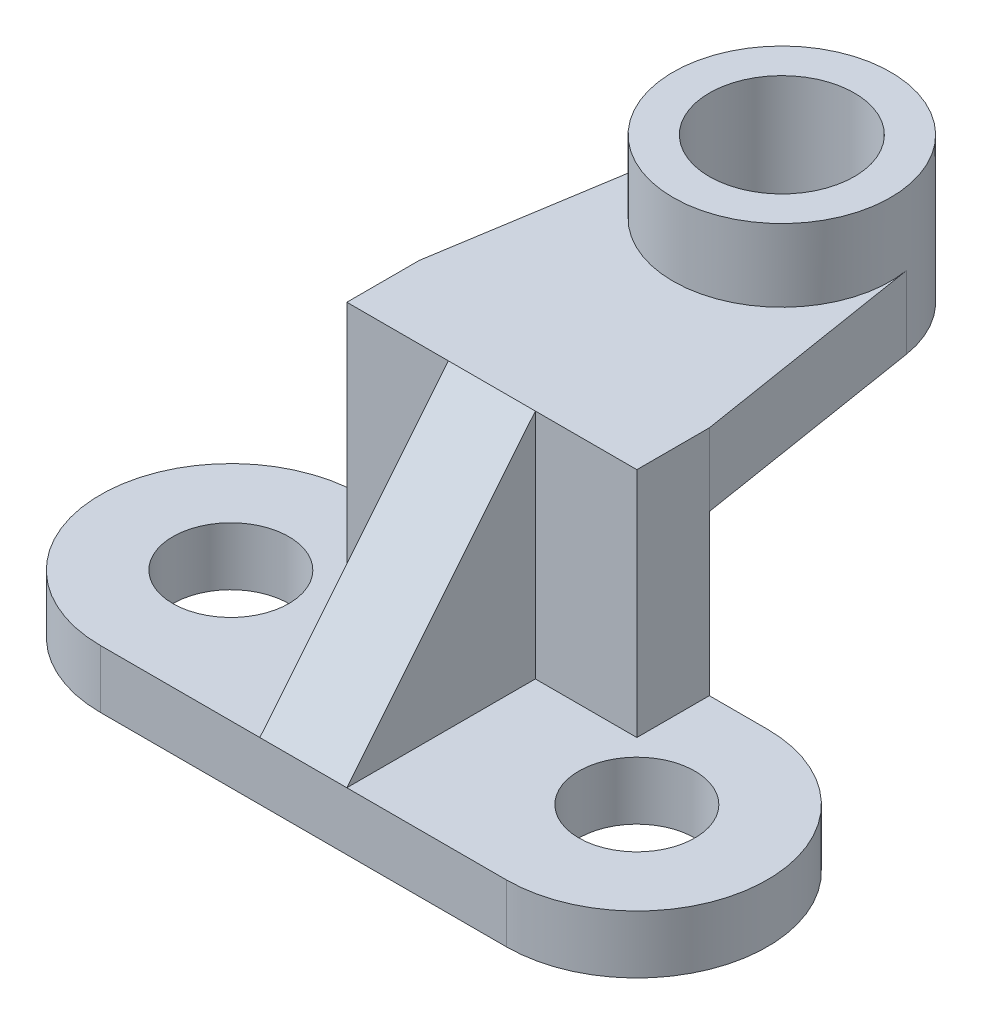
ISO-10303-21;
HEADER;
FILE_DESCRIPTION(('STEP AP214'),'2;1');
FILE_NAME('part.step','',(''),(''),'','','');
FILE_SCHEMA(('AUTOMOTIVE_DESIGN { 1 0 10303 214 1 1 1 1 }'));
ENDSEC;
DATA;
#1=APPLICATION_CONTEXT('core data for automotive mechanical design processes');
#2=APPLICATION_PROTOCOL_DEFINITION('international standard','automotive_design',2000,#1);
#3=PRODUCT_CONTEXT('',#1,'mechanical');
#4=PRODUCT('Part','Part','',(#3));
#5=PRODUCT_RELATED_PRODUCT_CATEGORY('part','',(#4));
#6=PRODUCT_DEFINITION_FORMATION('','',#4);
#7=PRODUCT_DEFINITION_CONTEXT('part definition',#1,'design');
#8=PRODUCT_DEFINITION('design','',#6,#7);
#9=PRODUCT_DEFINITION_SHAPE('','',#8);
#10=(LENGTH_UNIT() NAMED_UNIT(*) SI_UNIT(.MILLI.,.METRE.));
#11=(NAMED_UNIT(*) PLANE_ANGLE_UNIT() SI_UNIT($,.RADIAN.));
#12=(NAMED_UNIT(*) SI_UNIT($,.STERADIAN.) SOLID_ANGLE_UNIT());
#13=UNCERTAINTY_MEASURE_WITH_UNIT(LENGTH_MEASURE(1.E-05),#10,'distance_accuracy_value','');
#14=(GEOMETRIC_REPRESENTATION_CONTEXT(3) GLOBAL_UNCERTAINTY_ASSIGNED_CONTEXT((#13)) GLOBAL_UNIT_ASSIGNED_CONTEXT((#10,
#11,#12)) REPRESENTATION_CONTEXT('',''));
#15=CARTESIAN_POINT('',(0.,0.,0.));
#16=DIRECTION('',(0.,0.,1.));
#17=DIRECTION('',(1.,0.,0.));
#18=AXIS2_PLACEMENT_3D('',#15,#16,#17);
#19=CARTESIAN_POINT('',(-28.,8.,-18.));
#20=DIRECTION('',(0.,0.,1.));
#21=DIRECTION('',(1.,0.,0.));
#22=AXIS2_PLACEMENT_3D('',#19,#20,#21);
#23=PLANE('',#22);
#24=DIRECTION('',(-1.,0.,0.));
#25=VECTOR('',#24,1.);
#26=CARTESIAN_POINT('',(0.,30.,-18.));
#27=LINE('',#26,#25);
#28=CARTESIAN_POINT('',(20.,30.,-18.));
#29=VERTEX_POINT('',#28);
#30=CARTESIAN_POINT('',(-20.,30.,-18.));
#31=VERTEX_POINT('',#30);
#32=EDGE_CURVE('E161',#29,#31,#27,.T.);
#33=ORIENTED_EDGE('',*,*,#32,.F.);
#34=DIRECTION('',(0.,-1.,0.));
#35=VECTOR('',#34,1.);
#36=CARTESIAN_POINT('',(20.,40.,-18.));
#37=LINE('',#36,#35);
#38=CARTESIAN_POINT('',(20.,8.,-18.));
#39=VERTEX_POINT('',#38);
#40=EDGE_CURVE('E223',#29,#39,#37,.T.);
#41=ORIENTED_EDGE('',*,*,#40,.T.);
#42=DIRECTION('',(-1.,0.,0.));
#43=VECTOR('',#42,1.);
#44=CARTESIAN_POINT('',(-28.,8.,-18.));
#45=LINE('',#44,#43);
#46=CARTESIAN_POINT('',(28.,8.,-18.));
#47=VERTEX_POINT('',#46);
#48=EDGE_CURVE('E244',#47,#39,#45,.T.);
#49=ORIENTED_EDGE('',*,*,#48,.F.);
#50=DIRECTION('',(0.,-1.,0.));
#51=VECTOR('',#50,1.);
#52=CARTESIAN_POINT('',(28.,8.,-18.));
#53=LINE('',#52,#51);
#54=CARTESIAN_POINT('',(28.,0.,-18.));
#55=VERTEX_POINT('',#54);
#56=EDGE_CURVE('E41',#47,#55,#53,.T.);
#57=ORIENTED_EDGE('',*,*,#56,.T.);
#58=DIRECTION('',(-1.,0.,0.));
#59=VECTOR('',#58,1.);
#60=CARTESIAN_POINT('',(-28.,0.,-18.));
#61=LINE('',#60,#59);
#62=CARTESIAN_POINT('',(-28.,0.,-18.));
#63=VERTEX_POINT('',#62);
#64=EDGE_CURVE('E256',#55,#63,#61,.T.);
#65=ORIENTED_EDGE('',*,*,#64,.T.);
#66=DIRECTION('',(0.,-1.,0.));
#67=VECTOR('',#66,1.);
#68=CARTESIAN_POINT('',(-28.,8.,-18.));
#69=LINE('',#68,#67);
#70=CARTESIAN_POINT('',(-28.,8.,-18.));
#71=VERTEX_POINT('',#70);
#72=EDGE_CURVE('E265',#71,#63,#69,.T.);
#73=ORIENTED_EDGE('',*,*,#72,.F.);
#74=CARTESIAN_POINT('',(-20.,8.,-18.));
#75=VERTEX_POINT('',#74);
#76=EDGE_CURVE('E242',#75,#71,#45,.T.);
#77=ORIENTED_EDGE('',*,*,#76,.F.);
#78=DIRECTION('',(0.,-1.,0.));
#79=VECTOR('',#78,1.);
#80=CARTESIAN_POINT('',(-20.,40.,-18.));
#81=LINE('',#80,#79);
#82=EDGE_CURVE('E221',#31,#75,#81,.T.);
#83=ORIENTED_EDGE('',*,*,#82,.F.);
#84=EDGE_LOOP('',(#33,#41,#49,#57,#65,#73,#77,#83));
#85=FACE_BOUND('',#84,.T.);
#86=ADVANCED_FACE('F37',(#85),#23,.F.);
#87=CARTESIAN_POINT('',(28.,8.,0.));
#88=DIRECTION('',(0.,-1.,0.));
#89=DIRECTION('',(0.,0.,-1.));
#90=AXIS2_PLACEMENT_3D('',#87,#88,#89);
#91=PLANE('',#90);
#92=CARTESIAN_POINT('',(-28.,8.,0.));
#93=DIRECTION('',(0.,1.,0.));
#94=DIRECTION('',(0.,0.,1.));
#95=AXIS2_PLACEMENT_3D('',#92,#93,#94);
#96=CIRCLE('',#95,8.);
#97=CARTESIAN_POINT('',(-28.,8.,8.));
#98=VERTEX_POINT('',#97);
#99=EDGE_CURVE('E233',#98,#98,#96,.T.);
#100=ORIENTED_EDGE('',*,*,#99,.F.);
#101=EDGE_LOOP('',(#100));
#102=FACE_BOUND('',#101,.T.);
#103=DIRECTION('',(0.,0.,-1.));
#104=VECTOR('',#103,1.);
#105=CARTESIAN_POINT('',(-6.,8.,-8.));
#106=LINE('',#105,#104);
#107=CARTESIAN_POINT('',(-6.,8.,18.));
#108=VERTEX_POINT('',#107);
#109=CARTESIAN_POINT('',(-6.,8.,-8.));
#110=VERTEX_POINT('',#109);
#111=EDGE_CURVE('E188',#108,#110,#106,.T.);
#112=ORIENTED_EDGE('',*,*,#111,.T.);
#113=DIRECTION('',(1.,0.,0.));
#114=VECTOR('',#113,1.);
#115=CARTESIAN_POINT('',(-20.,8.,-8.00000000000004));
#116=LINE('',#115,#114);
#117=CARTESIAN_POINT('',(-20.,8.,-8.00000000000004));
#118=VERTEX_POINT('',#117);
#119=EDGE_CURVE('E202',#118,#110,#116,.T.);
#120=ORIENTED_EDGE('',*,*,#119,.F.);
#121=DIRECTION('',(0.,0.,1.));
#122=VECTOR('',#121,1.);
#123=CARTESIAN_POINT('',(-20.,8.,-18.));
#124=LINE('',#123,#122);
#125=EDGE_CURVE('E211',#75,#118,#124,.T.);
#126=ORIENTED_EDGE('',*,*,#125,.F.);
#127=ORIENTED_EDGE('',*,*,#76,.T.);
#128=CARTESIAN_POINT('',(-28.,8.,0.));
#129=DIRECTION('',(0.,1.,0.));
#130=DIRECTION('',(0.,0.,-1.));
#131=AXIS2_PLACEMENT_3D('',#128,#129,#130);
#132=CIRCLE('',#131,18.);
#133=CARTESIAN_POINT('',(-28.,8.,18.));
#134=VERTEX_POINT('',#133);
#135=EDGE_CURVE('E247',#71,#134,#132,.T.);
#136=ORIENTED_EDGE('',*,*,#135,.T.);
#137=DIRECTION('',(1.,0.,0.));
#138=VECTOR('',#137,1.);
#139=CARTESIAN_POINT('',(-28.,8.,18.));
#140=LINE('',#139,#138);
#141=EDGE_CURVE('E250',#134,#108,#140,.T.);
#142=ORIENTED_EDGE('',*,*,#141,.T.);
#143=EDGE_LOOP('',(#112,#120,#126,#127,#136,#142));
#144=FACE_BOUND('',#143,.T.);
#145=ADVANCED_FACE('F291',(#102,#144),#91,.F.);
#146=CARTESIAN_POINT('',(-20.,40.,-8.00000000000004));
#147=DIRECTION('',(0.,0.,-1.));
#148=DIRECTION('',(-1.,0.,0.));
#149=AXIS2_PLACEMENT_3D('',#146,#147,#148);
#150=PLANE('',#149);
#151=DIRECTION('',(0.,1.,0.));
#152=VECTOR('',#151,1.);
#153=CARTESIAN_POINT('',(-6.,40.,-8.));
#154=LINE('',#153,#152);
#155=CARTESIAN_POINT('',(-6.,40.,-8.));
#156=VERTEX_POINT('',#155);
#157=EDGE_CURVE('E191',#110,#156,#154,.T.);
#158=ORIENTED_EDGE('',*,*,#157,.T.);
#159=DIRECTION('',(1.,0.,0.));
#160=VECTOR('',#159,1.);
#161=CARTESIAN_POINT('',(-20.,40.,-8.00000000000004));
#162=LINE('',#161,#160);
#163=CARTESIAN_POINT('',(-20.,40.,-8.00000000000004));
#164=VERTEX_POINT('',#163);
#165=EDGE_CURVE('E205',#164,#156,#162,.T.);
#166=ORIENTED_EDGE('',*,*,#165,.F.);
#167=DIRECTION('',(0.,-1.,0.));
#168=VECTOR('',#167,1.);
#169=CARTESIAN_POINT('',(-20.,40.,-8.00000000000004));
#170=LINE('',#169,#168);
#171=EDGE_CURVE('E218',#164,#118,#170,.T.);
#172=ORIENTED_EDGE('',*,*,#171,.T.);
#173=ORIENTED_EDGE('',*,*,#119,.T.);
#174=EDGE_LOOP('',(#158,#166,#172,#173));
#175=FACE_BOUND('',#174,.T.);
#176=ADVANCED_FACE('F302',(#175),#150,.F.);
#177=CARTESIAN_POINT('',(28.,8.,0.));
#178=DIRECTION('',(0.,1.,0.));
#179=DIRECTION('',(0.,0.,1.));
#180=AXIS2_PLACEMENT_3D('',#177,#178,#179);
#181=CIRCLE('',#180,8.);
#182=CARTESIAN_POINT('',(28.,8.,8.));
#183=VERTEX_POINT('',#182);
#184=EDGE_CURVE('E227',#183,#183,#181,.T.);
#185=ORIENTED_EDGE('',*,*,#184,.F.);
#186=EDGE_LOOP('',(#185));
#187=FACE_BOUND('',#186,.T.);
#188=CARTESIAN_POINT('',(6.,8.,-8.));
#189=VERTEX_POINT('',#188);
#190=CARTESIAN_POINT('',(20.,8.,-8.));
#191=VERTEX_POINT('',#190);
#192=EDGE_CURVE('E61',#189,#191,#116,.T.);
#193=ORIENTED_EDGE('',*,*,#192,.F.);
#194=DIRECTION('',(0.,0.,-1.));
#195=VECTOR('',#194,1.);
#196=CARTESIAN_POINT('',(6.,8.,-8.));
#197=LINE('',#196,#195);
#198=CARTESIAN_POINT('',(6.,8.,18.));
#199=VERTEX_POINT('',#198);
#200=EDGE_CURVE('E181',#199,#189,#197,.T.);
#201=ORIENTED_EDGE('',*,*,#200,.F.);
#202=CARTESIAN_POINT('',(28.,8.,18.));
#203=VERTEX_POINT('',#202);
#204=EDGE_CURVE('E249',#199,#203,#140,.T.);
#205=ORIENTED_EDGE('',*,*,#204,.T.);
#206=CARTESIAN_POINT('',(28.,8.,0.));
#207=DIRECTION('',(0.,1.,0.));
#208=DIRECTION('',(0.,0.,-1.));
#209=AXIS2_PLACEMENT_3D('',#206,#207,#208);
#210=CIRCLE('',#209,18.);
#211=EDGE_CURVE('E239',#203,#47,#210,.T.);
#212=ORIENTED_EDGE('',*,*,#211,.T.);
#213=ORIENTED_EDGE('',*,*,#48,.T.);
#214=DIRECTION('',(0.,0.,-1.));
#215=VECTOR('',#214,1.);
#216=CARTESIAN_POINT('',(20.,8.,-18.));
#217=LINE('',#216,#215);
#218=EDGE_CURVE('E198',#191,#39,#217,.T.);
#219=ORIENTED_EDGE('',*,*,#218,.F.);
#220=EDGE_LOOP('',(#193,#201,#205,#212,#213,#219));
#221=FACE_BOUND('',#220,.T.);
#222=ADVANCED_FACE('F312',(#187,#221),#91,.F.);
#223=CARTESIAN_POINT('',(28.,0.,0.));
#224=DIRECTION('',(0.,-1.,0.));
#225=DIRECTION('',(0.,0.,-1.));
#226=AXIS2_PLACEMENT_3D('',#223,#224,#225);
#227=PLANE('',#226);
#228=CARTESIAN_POINT('',(-28.,0.,0.));
#229=DIRECTION('',(0.,1.,0.));
#230=DIRECTION('',(0.,0.,1.));
#231=AXIS2_PLACEMENT_3D('',#228,#229,#230);
#232=CIRCLE('',#231,8.);
#233=CARTESIAN_POINT('',(-28.,0.,8.));
#234=VERTEX_POINT('',#233);
#235=EDGE_CURVE('E230',#234,#234,#232,.T.);
#236=ORIENTED_EDGE('',*,*,#235,.T.);
#237=EDGE_LOOP('',(#236));
#238=FACE_BOUND('',#237,.T.);
#239=CARTESIAN_POINT('',(28.,0.,0.));
#240=DIRECTION('',(0.,1.,0.));
#241=DIRECTION('',(0.,0.,-1.));
#242=AXIS2_PLACEMENT_3D('',#239,#240,#241);
#243=CIRCLE('',#242,18.);
#244=CARTESIAN_POINT('',(28.,0.,18.));
#245=VERTEX_POINT('',#244);
#246=EDGE_CURVE('E236',#245,#55,#243,.T.);
#247=ORIENTED_EDGE('',*,*,#246,.F.);
#248=DIRECTION('',(1.,0.,0.));
#249=VECTOR('',#248,1.);
#250=CARTESIAN_POINT('',(-28.,0.,18.));
#251=LINE('',#250,#249);
#252=CARTESIAN_POINT('',(-28.,0.,18.));
#253=VERTEX_POINT('',#252);
#254=EDGE_CURVE('E243',#253,#245,#251,.T.);
#255=ORIENTED_EDGE('',*,*,#254,.F.);
#256=CARTESIAN_POINT('',(-28.,0.,0.));
#257=DIRECTION('',(0.,1.,0.));
#258=DIRECTION('',(0.,0.,-1.));
#259=AXIS2_PLACEMENT_3D('',#256,#257,#258);
#260=CIRCLE('',#259,18.);
#261=EDGE_CURVE('E258',#63,#253,#260,.T.);
#262=ORIENTED_EDGE('',*,*,#261,.F.);
#263=ORIENTED_EDGE('',*,*,#64,.F.);
#264=EDGE_LOOP('',(#247,#255,#262,#263));
#265=FACE_BOUND('',#264,.T.);
#266=CARTESIAN_POINT('',(28.,0.,0.));
#267=DIRECTION('',(0.,1.,0.));
#268=DIRECTION('',(0.,0.,1.));
#269=AXIS2_PLACEMENT_3D('',#266,#267,#268);
#270=CIRCLE('',#269,8.);
#271=CARTESIAN_POINT('',(28.,0.,8.));
#272=VERTEX_POINT('',#271);
#273=EDGE_CURVE('E226',#272,#272,#270,.T.);
#274=ORIENTED_EDGE('',*,*,#273,.T.);
#275=EDGE_LOOP('',(#274));
#276=FACE_BOUND('',#275,.T.);
#277=ADVANCED_FACE('F281',(#238,#265,#276),#227,.T.);
#278=CARTESIAN_POINT('',(28.,8.,0.));
#279=DIRECTION('',(0.,-1.,0.));
#280=DIRECTION('',(0.,0.,-1.));
#281=AXIS2_PLACEMENT_3D('',#278,#279,#280);
#282=CYLINDRICAL_SURFACE('',#281,18.);
#283=ORIENTED_EDGE('',*,*,#246,.T.);
#284=ORIENTED_EDGE('',*,*,#56,.F.);
#285=ORIENTED_EDGE('',*,*,#211,.F.);
#286=DIRECTION('',(0.,-1.,0.));
#287=VECTOR('',#286,1.);
#288=CARTESIAN_POINT('',(28.,8.,18.));
#289=LINE('',#288,#287);
#290=EDGE_CURVE('E253',#203,#245,#289,.T.);
#291=ORIENTED_EDGE('',*,*,#290,.T.);
#292=EDGE_LOOP('',(#283,#284,#285,#291));
#293=FACE_BOUND('',#292,.T.);
#294=ADVANCED_FACE('F39',(#293),#282,.T.);
#295=CARTESIAN_POINT('',(-28.,8.,0.));
#296=DIRECTION('',(0.,-1.,0.));
#297=DIRECTION('',(0.,0.,-1.));
#298=AXIS2_PLACEMENT_3D('',#295,#296,#297);
#299=CYLINDRICAL_SURFACE('',#298,18.);
#300=ORIENTED_EDGE('',*,*,#261,.T.);
#301=DIRECTION('',(0.,-1.,0.));
#302=VECTOR('',#301,1.);
#303=CARTESIAN_POINT('',(-28.,8.,18.));
#304=LINE('',#303,#302);
#305=EDGE_CURVE('E263',#134,#253,#304,.T.);
#306=ORIENTED_EDGE('',*,*,#305,.F.);
#307=ORIENTED_EDGE('',*,*,#135,.F.);
#308=ORIENTED_EDGE('',*,*,#72,.T.);
#309=EDGE_LOOP('',(#300,#306,#307,#308));
#310=FACE_BOUND('',#309,.T.);
#311=ADVANCED_FACE('F284',(#310),#299,.T.);
#312=CARTESIAN_POINT('',(-28.,8.,18.));
#313=DIRECTION('',(0.,0.,-1.));
#314=DIRECTION('',(-1.,0.,0.));
#315=AXIS2_PLACEMENT_3D('',#312,#313,#314);
#316=PLANE('',#315);
#317=ORIENTED_EDGE('',*,*,#254,.T.);
#318=ORIENTED_EDGE('',*,*,#290,.F.);
#319=ORIENTED_EDGE('',*,*,#204,.F.);
#320=DIRECTION('',(1.,0.,0.));
#321=VECTOR('',#320,1.);
#322=CARTESIAN_POINT('',(-6.,8.,18.));
#323=LINE('',#322,#321);
#324=EDGE_CURVE('E194',#108,#199,#323,.T.);
#325=ORIENTED_EDGE('',*,*,#324,.F.);
#326=ORIENTED_EDGE('',*,*,#141,.F.);
#327=ORIENTED_EDGE('',*,*,#305,.T.);
#328=EDGE_LOOP('',(#317,#318,#319,#325,#326,#327));
#329=FACE_BOUND('',#328,.T.);
#330=ADVANCED_FACE('F287',(#329),#316,.F.);
#331=CARTESIAN_POINT('',(-28.,8.,0.));
#332=DIRECTION('',(0.,-1.,0.));
#333=DIRECTION('',(0.,0.,-1.));
#334=AXIS2_PLACEMENT_3D('',#331,#332,#333);
#335=CYLINDRICAL_SURFACE('',#334,8.);
#336=ORIENTED_EDGE('',*,*,#99,.T.);
#337=EDGE_LOOP('',(#336));
#338=FACE_BOUND('',#337,.T.);
#339=ORIENTED_EDGE('',*,*,#235,.F.);
#340=EDGE_LOOP('',(#339));
#341=FACE_BOUND('',#340,.T.);
#342=ADVANCED_FACE('F336',(#338,#341),#335,.F.);
#343=CARTESIAN_POINT('',(28.,8.,0.));
#344=DIRECTION('',(0.,-1.,0.));
#345=DIRECTION('',(0.,0.,-1.));
#346=AXIS2_PLACEMENT_3D('',#343,#344,#345);
#347=CYLINDRICAL_SURFACE('',#346,8.);
#348=ORIENTED_EDGE('',*,*,#184,.T.);
#349=EDGE_LOOP('',(#348));
#350=FACE_BOUND('',#349,.T.);
#351=ORIENTED_EDGE('',*,*,#273,.F.);
#352=EDGE_LOOP('',(#351));
#353=FACE_BOUND('',#352,.T.);
#354=ADVANCED_FACE('F344',(#350,#353),#347,.F.);
#355=CARTESIAN_POINT('',(20.,40.,-18.));
#356=DIRECTION('',(-1.,0.,0.));
#357=DIRECTION('',(0.,0.,1.));
#358=AXIS2_PLACEMENT_3D('',#355,#356,#357);
#359=PLANE('',#358);
#360=ORIENTED_EDGE('',*,*,#218,.T.);
#361=ORIENTED_EDGE('',*,*,#40,.F.);
#362=CARTESIAN_POINT('',(20.,40.,-18.));
#363=VERTEX_POINT('',#362);
#364=EDGE_CURVE('E224',#363,#29,#37,.T.);
#365=ORIENTED_EDGE('',*,*,#364,.F.);
#366=DIRECTION('',(0.,0.,-1.));
#367=VECTOR('',#366,1.);
#368=CARTESIAN_POINT('',(20.,40.,-18.));
#369=LINE('',#368,#367);
#370=CARTESIAN_POINT('',(20.,40.,-8.));
#371=VERTEX_POINT('',#370);
#372=EDGE_CURVE('E146',#371,#363,#369,.T.);
#373=ORIENTED_EDGE('',*,*,#372,.F.);
#374=DIRECTION('',(0.,-1.,0.));
#375=VECTOR('',#374,1.);
#376=CARTESIAN_POINT('',(20.,40.,-8.));
#377=LINE('',#376,#375);
#378=EDGE_CURVE('E208',#371,#191,#377,.T.);
#379=ORIENTED_EDGE('',*,*,#378,.T.);
#380=EDGE_LOOP('',(#360,#361,#365,#373,#379));
#381=FACE_BOUND('',#380,.T.);
#382=ADVANCED_FACE('F314',(#381),#359,.F.);
#383=CARTESIAN_POINT('',(-20.,40.,-18.));
#384=DIRECTION('',(1.,0.,0.));
#385=DIRECTION('',(0.,0.,-1.));
#386=AXIS2_PLACEMENT_3D('',#383,#384,#385);
#387=PLANE('',#386);
#388=ORIENTED_EDGE('',*,*,#125,.T.);
#389=ORIENTED_EDGE('',*,*,#171,.F.);
#390=DIRECTION('',(0.,0.,1.));
#391=VECTOR('',#390,1.);
#392=CARTESIAN_POINT('',(-20.,40.,-18.));
#393=LINE('',#392,#391);
#394=CARTESIAN_POINT('',(-20.,40.,-18.));
#395=VERTEX_POINT('',#394);
#396=EDGE_CURVE('E201',#395,#164,#393,.T.);
#397=ORIENTED_EDGE('',*,*,#396,.F.);
#398=EDGE_CURVE('E172',#395,#31,#81,.T.);
#399=ORIENTED_EDGE('',*,*,#398,.T.);
#400=ORIENTED_EDGE('',*,*,#82,.T.);
#401=EDGE_LOOP('',(#388,#389,#397,#399,#400));
#402=FACE_BOUND('',#401,.T.);
#403=ADVANCED_FACE('F298',(#402),#387,.F.);
#404=CARTESIAN_POINT('',(6.,40.,-8.00000000000001));
#405=VERTEX_POINT('',#404);
#406=EDGE_CURVE('E204',#405,#371,#162,.T.);
#407=ORIENTED_EDGE('',*,*,#406,.F.);
#408=DIRECTION('',(0.,1.,0.));
#409=VECTOR('',#408,1.);
#410=CARTESIAN_POINT('',(6.,40.,-8.));
#411=LINE('',#410,#409);
#412=EDGE_CURVE('E183',#189,#405,#411,.T.);
#413=ORIENTED_EDGE('',*,*,#412,.F.);
#414=ORIENTED_EDGE('',*,*,#192,.T.);
#415=ORIENTED_EDGE('',*,*,#378,.F.);
#416=EDGE_LOOP('',(#407,#413,#414,#415));
#417=FACE_BOUND('',#416,.T.);
#418=ADVANCED_FACE('F315',(#417),#150,.F.);
#419=CARTESIAN_POINT('',(0.,40.,0.));
#420=DIRECTION('',(0.,1.,0.));
#421=DIRECTION('',(0.,0.,1.));
#422=AXIS2_PLACEMENT_3D('',#419,#420,#421);
#423=PLANE('',#422);
#424=CARTESIAN_POINT('',(0.,40.,-48.));
#425=DIRECTION('',(0.,1.,0.));
#426=DIRECTION('',(0.,0.,1.));
#427=AXIS2_PLACEMENT_3D('',#424,#425,#426);
#428=CIRCLE('',#427,15.);
#429=CARTESIAN_POINT('',(-14.8109512920611,40.,-50.3739675280408));
#430=VERTEX_POINT('',#429);
#431=CARTESIAN_POINT('',(14.8109512920612,40.,-50.3739675280408));
#432=VERTEX_POINT('',#431);
#433=EDGE_CURVE('E11',#430,#432,#428,.T.);
#434=ORIENTED_EDGE('',*,*,#433,.F.);
#435=DIRECTION('',(0.158264501869384,0.,-0.987396752804077));
#436=VECTOR('',#435,1.);
#437=CARTESIAN_POINT('',(-22.3119043431004,40.,-3.57625485053505));
#438=LINE('',#437,#436);
#439=EDGE_CURVE('E149',#395,#430,#438,.T.);
#440=ORIENTED_EDGE('',*,*,#439,.F.);
#441=ORIENTED_EDGE('',*,*,#396,.T.);
#442=ORIENTED_EDGE('',*,*,#165,.T.);
#443=DIRECTION('',(1.,0.,0.));
#444=VECTOR('',#443,1.);
#445=CARTESIAN_POINT('',(-6.,40.,-8.));
#446=LINE('',#445,#444);
#447=EDGE_CURVE('E195',#156,#405,#446,.T.);
#448=ORIENTED_EDGE('',*,*,#447,.T.);
#449=ORIENTED_EDGE('',*,*,#406,.T.);
#450=ORIENTED_EDGE('',*,*,#372,.T.);
#451=DIRECTION('',(-0.158264501869384,0.,-0.987396752804077));
#452=VECTOR('',#451,1.);
#453=CARTESIAN_POINT('',(22.3119043431004,40.,-3.57625485053506));
#454=LINE('',#453,#452);
#455=EDGE_CURVE('E140',#363,#432,#454,.T.);
#456=ORIENTED_EDGE('',*,*,#455,.T.);
#457=EDGE_LOOP('',(#434,#440,#441,#442,#448,#449,#450,#456));
#458=FACE_BOUND('',#457,.T.);
#459=ADVANCED_FACE('F142',(#458),#423,.T.);
#460=CARTESIAN_POINT('',(-6.,8.,18.));
#461=DIRECTION('',(0.,0.630592625094466,0.776114000116266));
#462=DIRECTION('',(0.,-0.776114000116266,0.630592625094466));
#463=AXIS2_PLACEMENT_3D('',#460,#461,#462);
#464=PLANE('',#463);
#465=ORIENTED_EDGE('',*,*,#324,.T.);
#466=DIRECTION('',(0.,-0.776114000116266,0.630592625094466));
#467=VECTOR('',#466,1.);
#468=CARTESIAN_POINT('',(6.,8.,18.));
#469=LINE('',#468,#467);
#470=EDGE_CURVE('E53',#405,#199,#469,.T.);
#471=ORIENTED_EDGE('',*,*,#470,.F.);
#472=ORIENTED_EDGE('',*,*,#447,.F.);
#473=DIRECTION('',(0.,-0.776114000116266,0.630592625094466));
#474=VECTOR('',#473,1.);
#475=CARTESIAN_POINT('',(-6.,8.,18.));
#476=LINE('',#475,#474);
#477=EDGE_CURVE('E185',#156,#108,#476,.T.);
#478=ORIENTED_EDGE('',*,*,#477,.T.);
#479=EDGE_LOOP('',(#465,#471,#472,#478));
#480=FACE_BOUND('',#479,.T.);
#481=ADVANCED_FACE('F306',(#480),#464,.T.);
#482=CARTESIAN_POINT('',(-6.,0.,0.));
#483=DIRECTION('',(1.,0.,0.));
#484=DIRECTION('',(0.,0.,-1.));
#485=AXIS2_PLACEMENT_3D('',#482,#483,#484);
#486=PLANE('',#485);
#487=ORIENTED_EDGE('',*,*,#477,.F.);
#488=ORIENTED_EDGE('',*,*,#157,.F.);
#489=ORIENTED_EDGE('',*,*,#111,.F.);
#490=EDGE_LOOP('',(#487,#488,#489));
#491=FACE_BOUND('',#490,.T.);
#492=ADVANCED_FACE('F305',(#491),#486,.F.);
#493=CARTESIAN_POINT('',(6.,0.,0.));
#494=DIRECTION('',(1.,0.,0.));
#495=DIRECTION('',(0.,0.,-1.));
#496=AXIS2_PLACEMENT_3D('',#493,#494,#495);
#497=PLANE('',#496);
#498=ORIENTED_EDGE('',*,*,#470,.T.);
#499=ORIENTED_EDGE('',*,*,#200,.T.);
#500=ORIENTED_EDGE('',*,*,#412,.T.);
#501=EDGE_LOOP('',(#498,#499,#500));
#502=FACE_BOUND('',#501,.T.);
#503=ADVANCED_FACE('F309',(#502),#497,.T.);
#504=CARTESIAN_POINT('',(22.3119043431004,30.,-3.57625485053506));
#505=DIRECTION('',(0.987396752804077,0.,-0.158264501869384));
#506=DIRECTION('',(-0.158264501869384,0.,-0.987396752804077));
#507=AXIS2_PLACEMENT_3D('',#504,#505,#506);
#508=PLANE('',#507);
#509=ORIENTED_EDGE('',*,*,#455,.F.);
#510=ORIENTED_EDGE('',*,*,#364,.T.);
#511=DIRECTION('',(-0.158264501869384,0.,-0.987396752804077));
#512=VECTOR('',#511,1.);
#513=CARTESIAN_POINT('',(22.3119043431004,30.,-3.57625485053506));
#514=LINE('',#513,#512);
#515=CARTESIAN_POINT('',(14.8109512920612,30.,-50.3739675280408));
#516=VERTEX_POINT('',#515);
#517=EDGE_CURVE('E156',#29,#516,#514,.T.);
#518=ORIENTED_EDGE('',*,*,#517,.T.);
#519=DIRECTION('',(0.,1.,0.));
#520=VECTOR('',#519,1.);
#521=CARTESIAN_POINT('',(14.8109512920612,30.,-50.3739675280408));
#522=LINE('',#521,#520);
#523=EDGE_CURVE('E153',#516,#432,#522,.T.);
#524=ORIENTED_EDGE('',*,*,#523,.T.);
#525=EDGE_LOOP('',(#509,#510,#518,#524));
#526=FACE_BOUND('',#525,.T.);
#527=ADVANCED_FACE('F154',(#526),#508,.T.);
#528=CARTESIAN_POINT('',(-22.3119043431004,30.,-3.57625485053505));
#529=DIRECTION('',(0.987396752804077,0.,0.158264501869384));
#530=DIRECTION('',(0.158264501869384,0.,-0.987396752804077));
#531=AXIS2_PLACEMENT_3D('',#528,#529,#530);
#532=PLANE('',#531);
#533=ORIENTED_EDGE('',*,*,#439,.T.);
#534=DIRECTION('',(0.,1.,0.));
#535=VECTOR('',#534,1.);
#536=CARTESIAN_POINT('',(-14.8109512920611,30.,-50.3739675280408));
#537=LINE('',#536,#535);
#538=CARTESIAN_POINT('',(-14.8109512920611,30.,-50.3739675280408));
#539=VERTEX_POINT('',#538);
#540=EDGE_CURVE('E160',#539,#430,#537,.T.);
#541=ORIENTED_EDGE('',*,*,#540,.F.);
#542=DIRECTION('',(0.158264501869384,0.,-0.987396752804077));
#543=VECTOR('',#542,1.);
#544=CARTESIAN_POINT('',(-22.3119043431004,30.,-3.57625485053505));
#545=LINE('',#544,#543);
#546=EDGE_CURVE('E529',#31,#539,#545,.T.);
#547=ORIENTED_EDGE('',*,*,#546,.F.);
#548=ORIENTED_EDGE('',*,*,#398,.F.);
#549=EDGE_LOOP('',(#533,#541,#547,#548));
#550=FACE_BOUND('',#549,.T.);
#551=ADVANCED_FACE('F170',(#550),#532,.F.);
#552=CARTESIAN_POINT('',(0.,30.,-48.));
#553=DIRECTION('',(0.,1.,0.));
#554=DIRECTION('',(0.,0.,1.));
#555=AXIS2_PLACEMENT_3D('',#552,#553,#554);
#556=CYLINDRICAL_SURFACE('',#555,10.);
#557=CARTESIAN_POINT('',(0.,30.,-48.));
#558=DIRECTION('',(0.,1.,0.));
#559=DIRECTION('',(0.,0.,1.));
#560=AXIS2_PLACEMENT_3D('',#557,#558,#559);
#561=CIRCLE('',#560,10.);
#562=CARTESIAN_POINT('',(0.,30.,-38.));
#563=VERTEX_POINT('',#562);
#564=EDGE_CURVE('E174',#563,#563,#561,.T.);
#565=ORIENTED_EDGE('',*,*,#564,.F.);
#566=EDGE_LOOP('',(#565));
#567=FACE_BOUND('',#566,.T.);
#568=CARTESIAN_POINT('',(0.,50.,-48.));
#569=DIRECTION('',(0.,1.,0.));
#570=DIRECTION('',(0.,0.,1.));
#571=AXIS2_PLACEMENT_3D('',#568,#569,#570);
#572=CIRCLE('',#571,10.);
#573=CARTESIAN_POINT('',(0.,50.,-38.));
#574=VERTEX_POINT('',#573);
#575=EDGE_CURVE('E522',#574,#574,#572,.T.);
#576=ORIENTED_EDGE('',*,*,#575,.T.);
#577=EDGE_LOOP('',(#576));
#578=FACE_BOUND('',#577,.T.);
#579=ADVANCED_FACE('F401',(#567,#578),#556,.F.);
#580=CARTESIAN_POINT('',(0.,30.,-48.));
#581=DIRECTION('',(0.,1.,0.));
#582=DIRECTION('',(0.,0.,1.));
#583=AXIS2_PLACEMENT_3D('',#580,#581,#582);
#584=CYLINDRICAL_SURFACE('',#583,15.);
#585=ORIENTED_EDGE('',*,*,#540,.T.);
#586=ORIENTED_EDGE('',*,*,#433,.T.);
#587=ORIENTED_EDGE('',*,*,#523,.F.);
#588=CARTESIAN_POINT('',(0.,30.,-48.));
#589=DIRECTION('',(0.,1.,0.));
#590=DIRECTION('',(0.,0.,1.));
#591=AXIS2_PLACEMENT_3D('',#588,#589,#590);
#592=CIRCLE('',#591,15.);
#593=EDGE_CURVE('E167',#516,#539,#592,.T.);
#594=ORIENTED_EDGE('',*,*,#593,.T.);
#595=EDGE_LOOP('',(#585,#586,#587,#594));
#596=FACE_BOUND('',#595,.T.);
#597=CARTESIAN_POINT('',(0.,50.,-48.));
#598=DIRECTION('',(0.,1.,0.));
#599=DIRECTION('',(0.,0.,1.));
#600=AXIS2_PLACEMENT_3D('',#597,#598,#599);
#601=CIRCLE('',#600,15.);
#602=CARTESIAN_POINT('',(0.,50.,-33.));
#603=VERTEX_POINT('',#602);
#604=EDGE_CURVE('E150',#603,#603,#601,.T.);
#605=ORIENTED_EDGE('',*,*,#604,.F.);
#606=EDGE_LOOP('',(#605));
#607=FACE_BOUND('',#606,.T.);
#608=ADVANCED_FACE('F163',(#596,#607),#584,.T.);
#609=CARTESIAN_POINT('',(0.,30.,0.));
#610=DIRECTION('',(0.,1.,0.));
#611=DIRECTION('',(0.,0.,1.));
#612=AXIS2_PLACEMENT_3D('',#609,#610,#611);
#613=PLANE('',#612);
#614=ORIENTED_EDGE('',*,*,#564,.T.);
#615=EDGE_LOOP('',(#614));
#616=FACE_BOUND('',#615,.T.);
#617=ORIENTED_EDGE('',*,*,#517,.F.);
#618=ORIENTED_EDGE('',*,*,#32,.T.);
#619=ORIENTED_EDGE('',*,*,#546,.T.);
#620=ORIENTED_EDGE('',*,*,#593,.F.);
#621=EDGE_LOOP('',(#617,#618,#619,#620));
#622=FACE_BOUND('',#621,.T.);
#623=ADVANCED_FACE('F376',(#616,#622),#613,.F.);
#624=CARTESIAN_POINT('',(0.,50.,-48.));
#625=DIRECTION('',(0.,1.,0.));
#626=DIRECTION('',(0.,0.,1.));
#627=AXIS2_PLACEMENT_3D('',#624,#625,#626);
#628=PLANE('',#627);
#629=ORIENTED_EDGE('',*,*,#604,.T.);
#630=EDGE_LOOP('',(#629));
#631=FACE_BOUND('',#630,.T.);
#632=ORIENTED_EDGE('',*,*,#575,.F.);
#633=EDGE_LOOP('',(#632));
#634=FACE_BOUND('',#633,.T.);
#635=ADVANCED_FACE('F381',(#631,#634),#628,.T.);
#636=CLOSED_SHELL('',(#86,#145,#176,#222,#277,#294,#311,#330,#342,#354,#382,#403,#418,#459,#481,
#492,#503,#527,#551,#579,#608,#623,#635));
#637=MANIFOLD_SOLID_BREP('B2',#636);
#638=ADVANCED_BREP_SHAPE_REPRESENTATION('',(#18,#637),#14);
#639=SHAPE_DEFINITION_REPRESENTATION(#9,#638);
ENDSEC;
END-ISO-10303-21;
